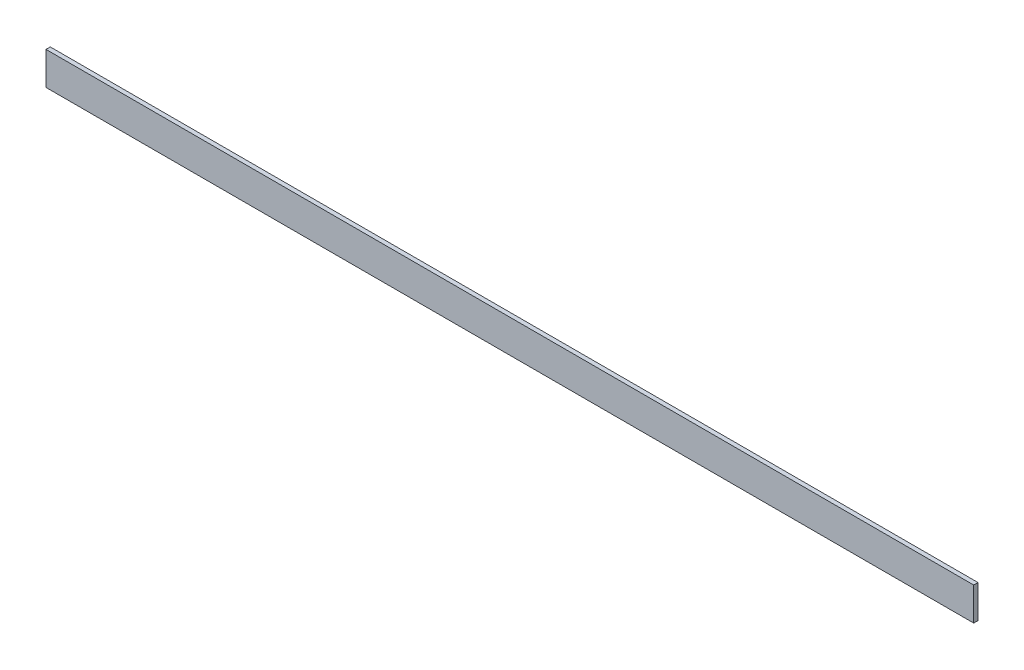
ISO-10303-21;
HEADER;
FILE_DESCRIPTION(('STEP AP214'),'2;1');
FILE_NAME('part.step','',(''),(''),'','','');
FILE_SCHEMA(('AUTOMOTIVE_DESIGN { 1 0 10303 214 1 1 1 1 }'));
ENDSEC;
DATA;
#1=APPLICATION_CONTEXT('core data for automotive mechanical design processes');
#2=APPLICATION_PROTOCOL_DEFINITION('international standard','automotive_design',2000,#1);
#3=PRODUCT_CONTEXT('',#1,'mechanical');
#4=PRODUCT('Part','Part','',(#3));
#5=PRODUCT_RELATED_PRODUCT_CATEGORY('part','',(#4));
#6=PRODUCT_DEFINITION_FORMATION('','',#4);
#7=PRODUCT_DEFINITION_CONTEXT('part definition',#1,'design');
#8=PRODUCT_DEFINITION('design','',#6,#7);
#9=PRODUCT_DEFINITION_SHAPE('','',#8);
#10=(LENGTH_UNIT() NAMED_UNIT(*) SI_UNIT(.MILLI.,.METRE.));
#11=(NAMED_UNIT(*) PLANE_ANGLE_UNIT() SI_UNIT($,.RADIAN.));
#12=(NAMED_UNIT(*) SI_UNIT($,.STERADIAN.) SOLID_ANGLE_UNIT());
#13=UNCERTAINTY_MEASURE_WITH_UNIT(LENGTH_MEASURE(1.E-05),#10,'distance_accuracy_value','');
#14=(GEOMETRIC_REPRESENTATION_CONTEXT(3) GLOBAL_UNCERTAINTY_ASSIGNED_CONTEXT((#13)) GLOBAL_UNIT_ASSIGNED_CONTEXT((#10,
#11,#12)) REPRESENTATION_CONTEXT('',''));
#15=CARTESIAN_POINT('',(0.,0.,0.));
#16=DIRECTION('',(0.,0.,1.));
#17=DIRECTION('',(1.,0.,0.));
#18=AXIS2_PLACEMENT_3D('',#15,#16,#17);
#19=CARTESIAN_POINT('',(0.,0.,3.302));
#20=DIRECTION('',(1.,0.,0.));
#21=DIRECTION('',(0.,0.,-1.));
#22=AXIS2_PLACEMENT_3D('',#19,#20,#21);
#23=PLANE('',#22);
#24=DIRECTION('',(0.,-1.,0.));
#25=VECTOR('',#24,1.);
#26=CARTESIAN_POINT('',(0.,0.,0.));
#27=LINE('',#26,#25);
#28=CARTESIAN_POINT('',(0.,25.4,0.));
#29=VERTEX_POINT('',#28);
#30=CARTESIAN_POINT('',(0.,0.,0.));
#31=VERTEX_POINT('',#30);
#32=EDGE_CURVE('E130',#29,#31,#27,.T.);
#33=ORIENTED_EDGE('',*,*,#32,.T.);
#34=DIRECTION('',(0.,0.,-1.));
#35=VECTOR('',#34,1.);
#36=CARTESIAN_POINT('',(0.,0.,3.302));
#37=LINE('',#36,#35);
#38=CARTESIAN_POINT('',(0.,0.,3.302));
#39=VERTEX_POINT('',#38);
#40=EDGE_CURVE('E12',#39,#31,#37,.T.);
#41=ORIENTED_EDGE('',*,*,#40,.F.);
#42=DIRECTION('',(0.,-1.,0.));
#43=VECTOR('',#42,1.);
#44=CARTESIAN_POINT('',(0.,0.,3.302));
#45=LINE('',#44,#43);
#46=CARTESIAN_POINT('',(0.,25.4,3.302));
#47=VERTEX_POINT('',#46);
#48=EDGE_CURVE('E98',#47,#39,#45,.T.);
#49=ORIENTED_EDGE('',*,*,#48,.F.);
#50=DIRECTION('',(0.,0.,-1.));
#51=VECTOR('',#50,1.);
#52=CARTESIAN_POINT('',(0.,25.4,3.302));
#53=LINE('',#52,#51);
#54=EDGE_CURVE('E106',#47,#29,#53,.T.);
#55=ORIENTED_EDGE('',*,*,#54,.T.);
#56=EDGE_LOOP('',(#33,#41,#49,#55));
#57=FACE_BOUND('',#56,.T.);
#58=ADVANCED_FACE('F50',(#57),#23,.F.);
#59=CARTESIAN_POINT('',(0.,0.,3.302));
#60=DIRECTION('',(0.,1.,0.));
#61=DIRECTION('',(0.,0.,1.));
#62=AXIS2_PLACEMENT_3D('',#59,#60,#61);
#63=PLANE('',#62);
#64=DIRECTION('',(1.,0.,0.));
#65=VECTOR('',#64,1.);
#66=CARTESIAN_POINT('',(0.,0.,0.));
#67=LINE('',#66,#65);
#68=CARTESIAN_POINT('',(714.502,0.,0.));
#69=VERTEX_POINT('',#68);
#70=EDGE_CURVE('E105',#31,#69,#67,.T.);
#71=ORIENTED_EDGE('',*,*,#70,.T.);
#72=DIRECTION('',(0.,0.,-1.));
#73=VECTOR('',#72,1.);
#74=CARTESIAN_POINT('',(714.502,0.,3.302));
#75=LINE('',#74,#73);
#76=CARTESIAN_POINT('',(714.502,0.,3.302));
#77=VERTEX_POINT('',#76);
#78=EDGE_CURVE('E54',#77,#69,#75,.T.);
#79=ORIENTED_EDGE('',*,*,#78,.F.);
#80=DIRECTION('',(1.,0.,0.));
#81=VECTOR('',#80,1.);
#82=CARTESIAN_POINT('',(0.,0.,3.302));
#83=LINE('',#82,#81);
#84=EDGE_CURVE('E91',#39,#77,#83,.T.);
#85=ORIENTED_EDGE('',*,*,#84,.F.);
#86=ORIENTED_EDGE('',*,*,#40,.T.);
#87=EDGE_LOOP('',(#71,#79,#85,#86));
#88=FACE_BOUND('',#87,.T.);
#89=ADVANCED_FACE('F101',(#88),#63,.F.);
#90=CARTESIAN_POINT('',(714.502,0.,3.302));
#91=DIRECTION('',(-1.,0.,0.));
#92=DIRECTION('',(0.,0.,1.));
#93=AXIS2_PLACEMENT_3D('',#90,#91,#92);
#94=PLANE('',#93);
#95=DIRECTION('',(0.,1.,0.));
#96=VECTOR('',#95,1.);
#97=CARTESIAN_POINT('',(714.502,0.,0.));
#98=LINE('',#97,#96);
#99=CARTESIAN_POINT('',(714.502,25.4,0.));
#100=VERTEX_POINT('',#99);
#101=EDGE_CURVE('E78',#69,#100,#98,.T.);
#102=ORIENTED_EDGE('',*,*,#101,.T.);
#103=DIRECTION('',(0.,0.,-1.));
#104=VECTOR('',#103,1.);
#105=CARTESIAN_POINT('',(714.502,25.4,3.302));
#106=LINE('',#105,#104);
#107=CARTESIAN_POINT('',(714.502,25.4,3.302));
#108=VERTEX_POINT('',#107);
#109=EDGE_CURVE('E103',#108,#100,#106,.T.);
#110=ORIENTED_EDGE('',*,*,#109,.F.);
#111=DIRECTION('',(0.,1.,0.));
#112=VECTOR('',#111,1.);
#113=CARTESIAN_POINT('',(714.502,0.,3.302));
#114=LINE('',#113,#112);
#115=EDGE_CURVE('E96',#77,#108,#114,.T.);
#116=ORIENTED_EDGE('',*,*,#115,.F.);
#117=ORIENTED_EDGE('',*,*,#78,.T.);
#118=EDGE_LOOP('',(#102,#110,#116,#117));
#119=FACE_BOUND('',#118,.T.);
#120=ADVANCED_FACE('F102',(#119),#94,.F.);
#121=CARTESIAN_POINT('',(0.,25.4,3.302));
#122=DIRECTION('',(0.,-1.,0.));
#123=DIRECTION('',(1.,0.,0.));
#124=AXIS2_PLACEMENT_3D('',#121,#122,#123);
#125=PLANE('',#124);
#126=DIRECTION('',(-1.,0.,0.));
#127=VECTOR('',#126,1.);
#128=CARTESIAN_POINT('',(0.,25.4,0.));
#129=LINE('',#128,#127);
#130=EDGE_CURVE('E88',#100,#29,#129,.T.);
#131=ORIENTED_EDGE('',*,*,#130,.T.);
#132=ORIENTED_EDGE('',*,*,#54,.F.);
#133=DIRECTION('',(-1.,0.,0.));
#134=VECTOR('',#133,1.);
#135=CARTESIAN_POINT('',(0.,25.4,3.302));
#136=LINE('',#135,#134);
#137=EDGE_CURVE('E64',#108,#47,#136,.T.);
#138=ORIENTED_EDGE('',*,*,#137,.F.);
#139=ORIENTED_EDGE('',*,*,#109,.T.);
#140=EDGE_LOOP('',(#131,#132,#138,#139));
#141=FACE_BOUND('',#140,.T.);
#142=ADVANCED_FACE('F125',(#141),#125,.F.);
#143=CARTESIAN_POINT('',(0.,0.,3.302));
#144=DIRECTION('',(0.,0.,-1.));
#145=DIRECTION('',(-1.,0.,0.));
#146=AXIS2_PLACEMENT_3D('',#143,#144,#145);
#147=PLANE('',#146);
#148=ORIENTED_EDGE('',*,*,#48,.T.);
#149=ORIENTED_EDGE('',*,*,#84,.T.);
#150=ORIENTED_EDGE('',*,*,#115,.T.);
#151=ORIENTED_EDGE('',*,*,#137,.T.);
#152=EDGE_LOOP('',(#148,#149,#150,#151));
#153=FACE_BOUND('',#152,.T.);
#154=ADVANCED_FACE('F94',(#153),#147,.F.);
#155=CARTESIAN_POINT('',(0.,0.,0.));
#156=DIRECTION('',(0.,0.,-1.));
#157=DIRECTION('',(-1.,0.,0.));
#158=AXIS2_PLACEMENT_3D('',#155,#156,#157);
#159=PLANE('',#158);
#160=ORIENTED_EDGE('',*,*,#32,.F.);
#161=ORIENTED_EDGE('',*,*,#130,.F.);
#162=ORIENTED_EDGE('',*,*,#101,.F.);
#163=ORIENTED_EDGE('',*,*,#70,.F.);
#164=EDGE_LOOP('',(#160,#161,#162,#163));
#165=FACE_BOUND('',#164,.T.);
#166=ADVANCED_FACE('F123',(#165),#159,.T.);
#167=CLOSED_SHELL('',(#58,#89,#120,#142,#154,#166));
#168=MANIFOLD_SOLID_BREP('B2',#167);
#169=ADVANCED_BREP_SHAPE_REPRESENTATION('',(#18,#168),#14);
#170=SHAPE_DEFINITION_REPRESENTATION(#9,#169);
ENDSEC;
END-ISO-10303-21;
